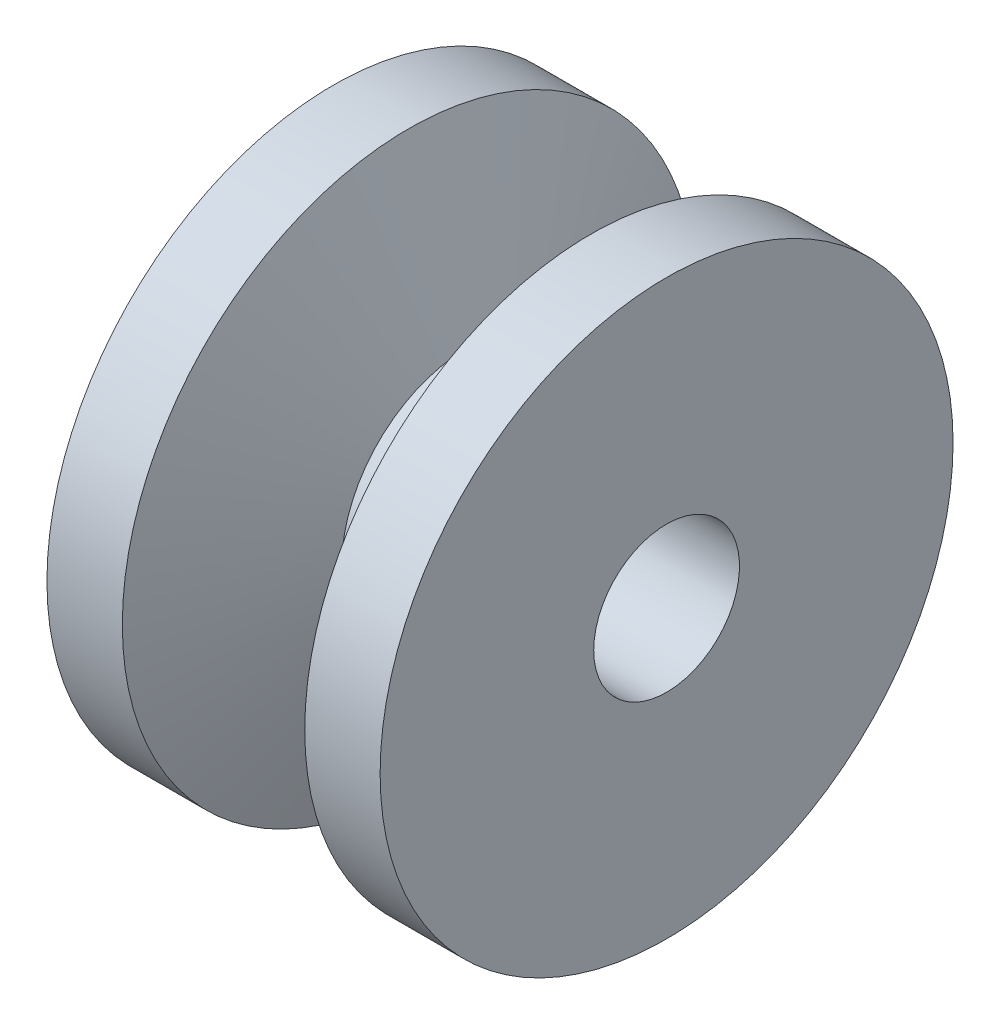
ISO-10303-21;
HEADER;
FILE_DESCRIPTION(('STEP AP214'),'2;1');
FILE_NAME('part.step','',(''),(''),'','','');
FILE_SCHEMA(('AUTOMOTIVE_DESIGN { 1 0 10303 214 1 1 1 1 }'));
ENDSEC;
DATA;
#1=APPLICATION_CONTEXT('core data for automotive mechanical design processes');
#2=APPLICATION_PROTOCOL_DEFINITION('international standard','automotive_design',2000,#1);
#3=PRODUCT_CONTEXT('',#1,'mechanical');
#4=PRODUCT('Part','Part','',(#3));
#5=PRODUCT_RELATED_PRODUCT_CATEGORY('part','',(#4));
#6=PRODUCT_DEFINITION_FORMATION('','',#4);
#7=PRODUCT_DEFINITION_CONTEXT('part definition',#1,'design');
#8=PRODUCT_DEFINITION('design','',#6,#7);
#9=PRODUCT_DEFINITION_SHAPE('','',#8);
#10=(LENGTH_UNIT() NAMED_UNIT(*) SI_UNIT(.MILLI.,.METRE.));
#11=(NAMED_UNIT(*) PLANE_ANGLE_UNIT() SI_UNIT($,.RADIAN.));
#12=(NAMED_UNIT(*) SI_UNIT($,.STERADIAN.) SOLID_ANGLE_UNIT());
#13=UNCERTAINTY_MEASURE_WITH_UNIT(LENGTH_MEASURE(1.E-05),#10,'distance_accuracy_value','');
#14=(GEOMETRIC_REPRESENTATION_CONTEXT(3) GLOBAL_UNCERTAINTY_ASSIGNED_CONTEXT((#13)) GLOBAL_UNIT_ASSIGNED_CONTEXT((#10,
#11,#12)) REPRESENTATION_CONTEXT('',''));
#15=CARTESIAN_POINT('',(0.,0.,0.));
#16=DIRECTION('',(0.,0.,1.));
#17=DIRECTION('',(1.,0.,0.));
#18=AXIS2_PLACEMENT_3D('',#15,#16,#17);
#19=CARTESIAN_POINT('',(0.,0.,-14.478));
#20=DIRECTION('',(1.,0.,0.));
#21=DIRECTION('',(0.,0.,-1.));
#22=AXIS2_PLACEMENT_3D('',#19,#20,#21);
#23=PLANE('',#22);
#24=CARTESIAN_POINT('',(0.,0.,0.));
#25=DIRECTION('',(-1.,0.,0.));
#26=DIRECTION('',(0.,0.,1.));
#27=AXIS2_PLACEMENT_3D('',#24,#25,#26);
#28=CIRCLE('',#27,3.683);
#29=CARTESIAN_POINT('',(0.,0.,3.683));
#30=VERTEX_POINT('',#29);
#31=EDGE_CURVE('E10',#30,#30,#28,.T.);
#32=ORIENTED_EDGE('',*,*,#31,.F.);
#33=EDGE_LOOP('',(#32));
#34=FACE_BOUND('',#33,.T.);
#35=CARTESIAN_POINT('',(0.,0.,0.));
#36=DIRECTION('',(-1.,0.,0.));
#37=DIRECTION('',(0.,0.,1.));
#38=AXIS2_PLACEMENT_3D('',#35,#36,#37);
#39=CIRCLE('',#38,14.478);
#40=CARTESIAN_POINT('',(0.,0.,14.478));
#41=VERTEX_POINT('',#40);
#42=EDGE_CURVE('E62',#41,#41,#39,.T.);
#43=ORIENTED_EDGE('',*,*,#42,.T.);
#44=EDGE_LOOP('',(#43));
#45=FACE_BOUND('',#44,.T.);
#46=ADVANCED_FACE('F34',(#34,#45),#23,.F.);
#47=CARTESIAN_POINT('',(0.,0.,0.));
#48=DIRECTION('',(-1.,0.,0.));
#49=DIRECTION('',(0.,0.,1.));
#50=AXIS2_PLACEMENT_3D('',#47,#48,#49);
#51=CYLINDRICAL_SURFACE('',#50,3.683);
#52=CARTESIAN_POINT('',(16.8387001282313,0.,0.));
#53=DIRECTION('',(-1.,0.,0.));
#54=DIRECTION('',(0.,0.,1.));
#55=AXIS2_PLACEMENT_3D('',#52,#53,#54);
#56=CIRCLE('',#55,3.683);
#57=CARTESIAN_POINT('',(16.8387001282313,0.,3.683));
#58=VERTEX_POINT('',#57);
#59=EDGE_CURVE('E40',#58,#58,#56,.T.);
#60=ORIENTED_EDGE('',*,*,#59,.F.);
#61=EDGE_LOOP('',(#60));
#62=FACE_BOUND('',#61,.T.);
#63=ORIENTED_EDGE('',*,*,#31,.T.);
#64=EDGE_LOOP('',(#63));
#65=FACE_BOUND('',#64,.T.);
#66=ADVANCED_FACE('F99',(#62,#65),#51,.F.);
#67=CARTESIAN_POINT('',(16.8387001282313,0.,-14.478));
#68=DIRECTION('',(-1.,0.,0.));
#69=DIRECTION('',(0.,0.,1.));
#70=AXIS2_PLACEMENT_3D('',#67,#68,#69);
#71=PLANE('',#70);
#72=CARTESIAN_POINT('',(16.8387001282313,0.,0.));
#73=DIRECTION('',(-1.,0.,0.));
#74=DIRECTION('',(0.,0.,1.));
#75=AXIS2_PLACEMENT_3D('',#72,#73,#74);
#76=CIRCLE('',#75,14.478);
#77=CARTESIAN_POINT('',(16.8387001282313,0.,14.478));
#78=VERTEX_POINT('',#77);
#79=EDGE_CURVE('E44',#78,#78,#76,.T.);
#80=ORIENTED_EDGE('',*,*,#79,.F.);
#81=EDGE_LOOP('',(#80));
#82=FACE_BOUND('',#81,.T.);
#83=ORIENTED_EDGE('',*,*,#59,.T.);
#84=EDGE_LOOP('',(#83));
#85=FACE_BOUND('',#84,.T.);
#86=ADVANCED_FACE('F94',(#82,#85),#71,.F.);
#87=CARTESIAN_POINT('',(0.,0.,0.));
#88=DIRECTION('',(-1.,0.,0.));
#89=DIRECTION('',(0.,0.,1.));
#90=AXIS2_PLACEMENT_3D('',#87,#88,#89);
#91=CYLINDRICAL_SURFACE('',#90,14.478);
#92=CARTESIAN_POINT('',(13.0287001282313,0.,0.));
#93=DIRECTION('',(-1.,0.,0.));
#94=DIRECTION('',(0.,0.,1.));
#95=AXIS2_PLACEMENT_3D('',#92,#93,#94);
#96=CIRCLE('',#95,14.478);
#97=CARTESIAN_POINT('',(13.0287001282313,0.,14.478));
#98=VERTEX_POINT('',#97);
#99=EDGE_CURVE('E48',#98,#98,#96,.T.);
#100=ORIENTED_EDGE('',*,*,#99,.F.);
#101=EDGE_LOOP('',(#100));
#102=FACE_BOUND('',#101,.T.);
#103=ORIENTED_EDGE('',*,*,#79,.T.);
#104=EDGE_LOOP('',(#103));
#105=FACE_BOUND('',#104,.T.);
#106=ADVANCED_FACE('F88',(#102,#105),#91,.T.);
#107=CARTESIAN_POINT('',(13.0287001282313,0.,0.));
#108=DIRECTION('',(1.,0.,0.));
#109=DIRECTION('',(0.,0.,-1.));
#110=AXIS2_PLACEMENT_3D('',#107,#108,#109);
#111=CONICAL_SURFACE('',#110,14.478,1.22173047639603);
#112=CARTESIAN_POINT('',(10.0703500641157,0.,0.));
#113=DIRECTION('',(-1.,0.,0.));
#114=DIRECTION('',(0.,0.,1.));
#115=AXIS2_PLACEMENT_3D('',#112,#113,#114);
#116=CIRCLE('',#115,6.35);
#117=CARTESIAN_POINT('',(10.0703500641157,0.,6.35));
#118=VERTEX_POINT('',#117);
#119=EDGE_CURVE('E53',#118,#118,#116,.T.);
#120=ORIENTED_EDGE('',*,*,#119,.F.);
#121=EDGE_LOOP('',(#120));
#122=FACE_BOUND('',#121,.T.);
#123=ORIENTED_EDGE('',*,*,#99,.T.);
#124=EDGE_LOOP('',(#123));
#125=FACE_BOUND('',#124,.T.);
#126=ADVANCED_FACE('F82',(#122,#125),#111,.T.);
#127=CARTESIAN_POINT('',(0.,0.,0.));
#128=DIRECTION('',(-1.,0.,0.));
#129=DIRECTION('',(0.,0.,1.));
#130=AXIS2_PLACEMENT_3D('',#127,#128,#129);
#131=CYLINDRICAL_SURFACE('',#130,6.35);
#132=CARTESIAN_POINT('',(6.76835006411567,0.,0.));
#133=DIRECTION('',(-1.,0.,0.));
#134=DIRECTION('',(0.,0.,1.));
#135=AXIS2_PLACEMENT_3D('',#132,#133,#134);
#136=CIRCLE('',#135,6.35);
#137=CARTESIAN_POINT('',(6.76835006411567,0.,6.35));
#138=VERTEX_POINT('',#137);
#139=EDGE_CURVE('E56',#138,#138,#136,.T.);
#140=ORIENTED_EDGE('',*,*,#139,.F.);
#141=EDGE_LOOP('',(#140));
#142=FACE_BOUND('',#141,.T.);
#143=ORIENTED_EDGE('',*,*,#119,.T.);
#144=EDGE_LOOP('',(#143));
#145=FACE_BOUND('',#144,.T.);
#146=ADVANCED_FACE('F76',(#142,#145),#131,.T.);
#147=CARTESIAN_POINT('',(6.76835006411567,0.,0.));
#148=DIRECTION('',(-1.,0.,0.));
#149=DIRECTION('',(0.,0.,1.));
#150=AXIS2_PLACEMENT_3D('',#147,#148,#149);
#151=CONICAL_SURFACE('',#150,6.35,1.22173047639603);
#152=CARTESIAN_POINT('',(3.81,0.,0.));
#153=DIRECTION('',(-1.,0.,0.));
#154=DIRECTION('',(0.,0.,1.));
#155=AXIS2_PLACEMENT_3D('',#152,#153,#154);
#156=CIRCLE('',#155,14.478);
#157=CARTESIAN_POINT('',(3.81,0.,14.478));
#158=VERTEX_POINT('',#157);
#159=EDGE_CURVE('E59',#158,#158,#156,.T.);
#160=ORIENTED_EDGE('',*,*,#159,.F.);
#161=EDGE_LOOP('',(#160));
#162=FACE_BOUND('',#161,.T.);
#163=ORIENTED_EDGE('',*,*,#139,.T.);
#164=EDGE_LOOP('',(#163));
#165=FACE_BOUND('',#164,.T.);
#166=ADVANCED_FACE('F70',(#162,#165),#151,.T.);
#167=CARTESIAN_POINT('',(0.,0.,0.));
#168=DIRECTION('',(-1.,0.,0.));
#169=DIRECTION('',(0.,0.,1.));
#170=AXIS2_PLACEMENT_3D('',#167,#168,#169);
#171=CYLINDRICAL_SURFACE('',#170,14.478);
#172=ORIENTED_EDGE('',*,*,#42,.F.);
#173=EDGE_LOOP('',(#172));
#174=FACE_BOUND('',#173,.T.);
#175=ORIENTED_EDGE('',*,*,#159,.T.);
#176=EDGE_LOOP('',(#175));
#177=FACE_BOUND('',#176,.T.);
#178=ADVANCED_FACE('F67',(#174,#177),#171,.T.);
#179=CLOSED_SHELL('',(#46,#66,#86,#106,#126,#146,#166,#178));
#180=MANIFOLD_SOLID_BREP('B2',#179);
#181=ADVANCED_BREP_SHAPE_REPRESENTATION('',(#18,#180),#14);
#182=SHAPE_DEFINITION_REPRESENTATION(#9,#181);
ENDSEC;
END-ISO-10303-21;
